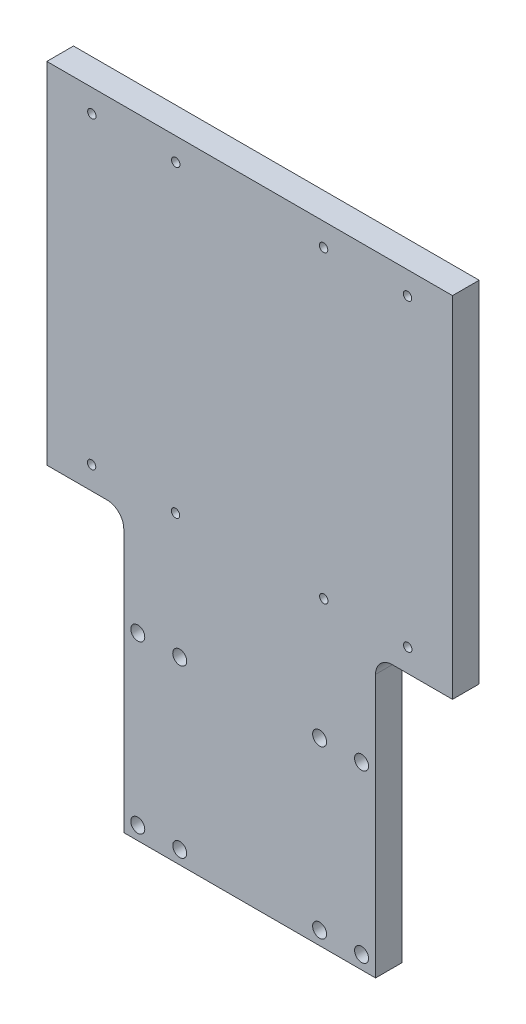
ISO-10303-21;
HEADER;
FILE_DESCRIPTION(('STEP AP214'),'2;1');
FILE_NAME('part.step','',(''),(''),'','','');
FILE_SCHEMA(('AUTOMOTIVE_DESIGN { 1 0 10303 214 1 1 1 1 }'));
ENDSEC;
DATA;
#1=APPLICATION_CONTEXT('core data for automotive mechanical design processes');
#2=APPLICATION_PROTOCOL_DEFINITION('international standard','automotive_design',2000,#1);
#3=PRODUCT_CONTEXT('',#1,'mechanical');
#4=PRODUCT('Part','Part','',(#3));
#5=PRODUCT_RELATED_PRODUCT_CATEGORY('part','',(#4));
#6=PRODUCT_DEFINITION_FORMATION('','',#4);
#7=PRODUCT_DEFINITION_CONTEXT('part definition',#1,'design');
#8=PRODUCT_DEFINITION('design','',#6,#7);
#9=PRODUCT_DEFINITION_SHAPE('','',#8);
#10=(LENGTH_UNIT() NAMED_UNIT(*) SI_UNIT(.MILLI.,.METRE.));
#11=(NAMED_UNIT(*) PLANE_ANGLE_UNIT() SI_UNIT($,.RADIAN.));
#12=(NAMED_UNIT(*) SI_UNIT($,.STERADIAN.) SOLID_ANGLE_UNIT());
#13=UNCERTAINTY_MEASURE_WITH_UNIT(LENGTH_MEASURE(1.E-05),#10,'distance_accuracy_value','');
#14=(GEOMETRIC_REPRESENTATION_CONTEXT(3) GLOBAL_UNCERTAINTY_ASSIGNED_CONTEXT((#13)) GLOBAL_UNIT_ASSIGNED_CONTEXT((#10,
#11,#12)) REPRESENTATION_CONTEXT('',''));
#15=CARTESIAN_POINT('',(0.,0.,0.));
#16=DIRECTION('',(0.,0.,1.));
#17=DIRECTION('',(1.,0.,0.));
#18=AXIS2_PLACEMENT_3D('',#15,#16,#17);
#19=CARTESIAN_POINT('',(-71.505,-62.5,9.53));
#20=DIRECTION('',(0.,1.,0.));
#21=DIRECTION('',(0.,0.,1.));
#22=AXIS2_PLACEMENT_3D('',#19,#20,#21);
#23=PLANE('',#22);
#24=DIRECTION('',(1.,0.,0.));
#25=VECTOR('',#24,1.);
#26=CARTESIAN_POINT('',(-71.505,-62.5,0.));
#27=LINE('',#26,#25);
#28=CARTESIAN_POINT('',(-72.505,-62.5,0.));
#29=VERTEX_POINT('',#28);
#30=CARTESIAN_POINT('',(-51.,-62.5,0.));
#31=VERTEX_POINT('',#30);
#32=EDGE_CURVE('E257',#29,#31,#27,.T.);
#33=ORIENTED_EDGE('',*,*,#32,.T.);
#34=DIRECTION('',(0.,0.,-1.));
#35=VECTOR('',#34,1.);
#36=CARTESIAN_POINT('',(-51.,-62.5,9.53));
#37=LINE('',#36,#35);
#38=CARTESIAN_POINT('',(-51.,-62.5,9.53));
#39=VERTEX_POINT('',#38);
#40=EDGE_CURVE('E57',#31,#39,#37,.F.);
#41=ORIENTED_EDGE('',*,*,#40,.T.);
#42=DIRECTION('',(1.,0.,0.));
#43=VECTOR('',#42,1.);
#44=CARTESIAN_POINT('',(-71.505,-62.5,9.53));
#45=LINE('',#44,#43);
#46=CARTESIAN_POINT('',(-72.505,-62.5,9.53));
#47=VERTEX_POINT('',#46);
#48=EDGE_CURVE('E258',#47,#39,#45,.T.);
#49=ORIENTED_EDGE('',*,*,#48,.F.);
#50=DIRECTION('',(0.,0.,1.));
#51=VECTOR('',#50,1.);
#52=CARTESIAN_POINT('',(-72.505,-62.5,-125.003999936002));
#53=LINE('',#52,#51);
#54=EDGE_CURVE('E153',#29,#47,#53,.T.);
#55=ORIENTED_EDGE('',*,*,#54,.F.);
#56=EDGE_LOOP('',(#33,#41,#49,#55));
#57=FACE_BOUND('',#56,.T.);
#58=ADVANCED_FACE('F42',(#57),#23,.F.);
#59=CARTESIAN_POINT('',(-45.,-62.5,9.53));
#60=DIRECTION('',(1.,0.,0.));
#61=DIRECTION('',(0.,1.,0.));
#62=AXIS2_PLACEMENT_3D('',#59,#60,#61);
#63=PLANE('',#62);
#64=DIRECTION('',(0.,-1.,0.));
#65=VECTOR('',#64,1.);
#66=CARTESIAN_POINT('',(-45.,-62.5,9.53));
#67=LINE('',#66,#65);
#68=CARTESIAN_POINT('',(-45.,-68.5,9.53));
#69=VERTEX_POINT('',#68);
#70=CARTESIAN_POINT('',(-45.,-162.5,9.53));
#71=VERTEX_POINT('',#70);
#72=EDGE_CURVE('E260',#69,#71,#67,.T.);
#73=ORIENTED_EDGE('',*,*,#72,.F.);
#74=DIRECTION('',(0.,0.,-1.));
#75=VECTOR('',#74,1.);
#76=CARTESIAN_POINT('',(-45.,-68.5,0.));
#77=LINE('',#76,#75);
#78=CARTESIAN_POINT('',(-45.,-68.5,0.));
#79=VERTEX_POINT('',#78);
#80=EDGE_CURVE('E287',#69,#79,#77,.T.);
#81=ORIENTED_EDGE('',*,*,#80,.T.);
#82=DIRECTION('',(0.,-1.,0.));
#83=VECTOR('',#82,1.);
#84=CARTESIAN_POINT('',(-45.,-62.5,0.));
#85=LINE('',#84,#83);
#86=CARTESIAN_POINT('',(-45.,-162.5,0.));
#87=VERTEX_POINT('',#86);
#88=EDGE_CURVE('E269',#79,#87,#85,.T.);
#89=ORIENTED_EDGE('',*,*,#88,.T.);
#90=DIRECTION('',(0.,0.,-1.));
#91=VECTOR('',#90,1.);
#92=CARTESIAN_POINT('',(-45.,-162.5,9.53));
#93=LINE('',#92,#91);
#94=EDGE_CURVE('E280',#71,#87,#93,.T.);
#95=ORIENTED_EDGE('',*,*,#94,.F.);
#96=EDGE_LOOP('',(#73,#81,#89,#95));
#97=FACE_BOUND('',#96,.T.);
#98=ADVANCED_FACE('F313',(#97),#63,.F.);
#99=CARTESIAN_POINT('',(-45.,-162.5,9.53));
#100=DIRECTION('',(0.,1.,0.));
#101=DIRECTION('',(0.,0.,1.));
#102=AXIS2_PLACEMENT_3D('',#99,#100,#101);
#103=PLANE('',#102);
#104=DIRECTION('',(1.,0.,0.));
#105=VECTOR('',#104,1.);
#106=CARTESIAN_POINT('',(-45.,-162.5,0.));
#107=LINE('',#106,#105);
#108=CARTESIAN_POINT('',(45.,-162.5,0.));
#109=VERTEX_POINT('',#108);
#110=EDGE_CURVE('E271',#87,#109,#107,.T.);
#111=ORIENTED_EDGE('',*,*,#110,.T.);
#112=DIRECTION('',(0.,0.,-1.));
#113=VECTOR('',#112,1.);
#114=CARTESIAN_POINT('',(45.,-162.5,9.53));
#115=LINE('',#114,#113);
#116=CARTESIAN_POINT('',(45.,-162.5,9.53));
#117=VERTEX_POINT('',#116);
#118=EDGE_CURVE('E267',#117,#109,#115,.T.);
#119=ORIENTED_EDGE('',*,*,#118,.F.);
#120=DIRECTION('',(1.,0.,0.));
#121=VECTOR('',#120,1.);
#122=CARTESIAN_POINT('',(-45.,-162.5,9.53));
#123=LINE('',#122,#121);
#124=EDGE_CURVE('E263',#71,#117,#123,.T.);
#125=ORIENTED_EDGE('',*,*,#124,.F.);
#126=ORIENTED_EDGE('',*,*,#94,.T.);
#127=EDGE_LOOP('',(#111,#119,#125,#126));
#128=FACE_BOUND('',#127,.T.);
#129=ADVANCED_FACE('F318',(#128),#103,.F.);
#130=CARTESIAN_POINT('',(45.,-62.5,9.53));
#131=DIRECTION('',(-1.,0.,0.));
#132=DIRECTION('',(0.,-1.,0.));
#133=AXIS2_PLACEMENT_3D('',#130,#131,#132);
#134=PLANE('',#133);
#135=DIRECTION('',(0.,1.,0.));
#136=VECTOR('',#135,1.);
#137=CARTESIAN_POINT('',(45.,-62.5,0.));
#138=LINE('',#137,#136);
#139=CARTESIAN_POINT('',(45.,-68.5,0.));
#140=VERTEX_POINT('',#139);
#141=EDGE_CURVE('E273',#109,#140,#138,.T.);
#142=ORIENTED_EDGE('',*,*,#141,.T.);
#143=DIRECTION('',(0.,0.,-1.));
#144=VECTOR('',#143,1.);
#145=CARTESIAN_POINT('',(45.,-68.5,9.53));
#146=LINE('',#145,#144);
#147=CARTESIAN_POINT('',(45.,-68.5,9.53));
#148=VERTEX_POINT('',#147);
#149=EDGE_CURVE('E285',#140,#148,#146,.F.);
#150=ORIENTED_EDGE('',*,*,#149,.T.);
#151=DIRECTION('',(0.,1.,0.));
#152=VECTOR('',#151,1.);
#153=CARTESIAN_POINT('',(45.,-62.5,9.53));
#154=LINE('',#153,#152);
#155=EDGE_CURVE('E129',#117,#148,#154,.T.);
#156=ORIENTED_EDGE('',*,*,#155,.F.);
#157=ORIENTED_EDGE('',*,*,#118,.T.);
#158=EDGE_LOOP('',(#142,#150,#156,#157));
#159=FACE_BOUND('',#158,.T.);
#160=ADVANCED_FACE('F299',(#159),#134,.F.);
#161=CARTESIAN_POINT('',(45.,-62.5,9.53));
#162=DIRECTION('',(0.,1.,0.));
#163=DIRECTION('',(0.,0.,1.));
#164=AXIS2_PLACEMENT_3D('',#161,#162,#163);
#165=PLANE('',#164);
#166=DIRECTION('',(1.,0.,0.));
#167=VECTOR('',#166,1.);
#168=CARTESIAN_POINT('',(45.,-62.5,9.53));
#169=LINE('',#168,#167);
#170=CARTESIAN_POINT('',(51.,-62.5,9.53));
#171=VERTEX_POINT('',#170);
#172=CARTESIAN_POINT('',(72.505,-62.5,9.53));
#173=VERTEX_POINT('',#172);
#174=EDGE_CURVE('E117',#171,#173,#169,.T.);
#175=ORIENTED_EDGE('',*,*,#174,.F.);
#176=DIRECTION('',(0.,0.,-1.));
#177=VECTOR('',#176,1.);
#178=CARTESIAN_POINT('',(51.,-62.5,0.));
#179=LINE('',#178,#177);
#180=CARTESIAN_POINT('',(51.,-62.5,0.));
#181=VERTEX_POINT('',#180);
#182=EDGE_CURVE('E283',#171,#181,#179,.T.);
#183=ORIENTED_EDGE('',*,*,#182,.T.);
#184=DIRECTION('',(1.,0.,0.));
#185=VECTOR('',#184,1.);
#186=CARTESIAN_POINT('',(45.,-62.5,0.));
#187=LINE('',#186,#185);
#188=CARTESIAN_POINT('',(72.505,-62.5,0.));
#189=VERTEX_POINT('',#188);
#190=EDGE_CURVE('E135',#181,#189,#187,.T.);
#191=ORIENTED_EDGE('',*,*,#190,.T.);
#192=DIRECTION('',(0.,0.,1.));
#193=VECTOR('',#192,1.);
#194=CARTESIAN_POINT('',(72.505,-62.5,-125.003999936002));
#195=LINE('',#194,#193);
#196=EDGE_CURVE('E132',#189,#173,#195,.T.);
#197=ORIENTED_EDGE('',*,*,#196,.T.);
#198=EDGE_LOOP('',(#175,#183,#191,#197));
#199=FACE_BOUND('',#198,.T.);
#200=ADVANCED_FACE('F133',(#199),#165,.F.);
#201=CARTESIAN_POINT('',(-71.505,62.5,9.53));
#202=DIRECTION('',(0.,-1.,0.));
#203=DIRECTION('',(0.,0.,-1.));
#204=AXIS2_PLACEMENT_3D('',#201,#202,#203);
#205=PLANE('',#204);
#206=DIRECTION('',(-1.,0.,0.));
#207=VECTOR('',#206,1.);
#208=CARTESIAN_POINT('',(-71.505,62.5,0.));
#209=LINE('',#208,#207);
#210=CARTESIAN_POINT('',(72.505,62.5,0.));
#211=VERTEX_POINT('',#210);
#212=CARTESIAN_POINT('',(-72.505,62.5,0.));
#213=VERTEX_POINT('',#212);
#214=EDGE_CURVE('E261',#211,#213,#209,.T.);
#215=ORIENTED_EDGE('',*,*,#214,.T.);
#216=DIRECTION('',(0.,0.,1.));
#217=VECTOR('',#216,1.);
#218=CARTESIAN_POINT('',(-72.505,62.5,-125.003999936002));
#219=LINE('',#218,#217);
#220=CARTESIAN_POINT('',(-72.505,62.5,9.53));
#221=VERTEX_POINT('',#220);
#222=EDGE_CURVE('E157',#213,#221,#219,.T.);
#223=ORIENTED_EDGE('',*,*,#222,.T.);
#224=DIRECTION('',(-1.,0.,0.));
#225=VECTOR('',#224,1.);
#226=CARTESIAN_POINT('',(-71.505,62.5,9.53));
#227=LINE('',#226,#225);
#228=CARTESIAN_POINT('',(72.505,62.5,9.53));
#229=VERTEX_POINT('',#228);
#230=EDGE_CURVE('E128',#229,#221,#227,.T.);
#231=ORIENTED_EDGE('',*,*,#230,.F.);
#232=DIRECTION('',(0.,0.,1.));
#233=VECTOR('',#232,1.);
#234=CARTESIAN_POINT('',(72.505,62.5,-125.003999936002));
#235=LINE('',#234,#233);
#236=EDGE_CURVE('E139',#211,#229,#235,.T.);
#237=ORIENTED_EDGE('',*,*,#236,.F.);
#238=EDGE_LOOP('',(#215,#223,#231,#237));
#239=FACE_BOUND('',#238,.T.);
#240=ADVANCED_FACE('F329',(#239),#205,.F.);
#241=CARTESIAN_POINT('',(-71.505,-62.5,9.53));
#242=DIRECTION('',(0.,0.,1.));
#243=DIRECTION('',(1.,0.,0.));
#244=AXIS2_PLACEMENT_3D('',#241,#242,#243);
#245=PLANE('',#244);
#246=CARTESIAN_POINT('',(-26.423186497269,54.3250000000001,9.53));
#247=DIRECTION('',(0.,0.,1.));
#248=DIRECTION('',(1.,0.,0.));
#249=AXIS2_PLACEMENT_3D('',#246,#247,#248);
#250=CIRCLE('',#249,1.5);
#251=CARTESIAN_POINT('',(-24.923186497269,54.3250000000001,9.53));
#252=VERTEX_POINT('',#251);
#253=EDGE_CURVE('E152',#252,#252,#250,.F.);
#254=ORIENTED_EDGE('',*,*,#253,.T.);
#255=EDGE_LOOP('',(#254));
#256=FACE_BOUND('',#255,.T.);
#257=CARTESIAN_POINT('',(-56.423186497269,54.325,9.53));
#258=DIRECTION('',(0.,0.,1.));
#259=DIRECTION('',(1.,0.,0.));
#260=AXIS2_PLACEMENT_3D('',#257,#258,#259);
#261=CIRCLE('',#260,1.5);
#262=CARTESIAN_POINT('',(-54.923186497269,54.325,9.53));
#263=VERTEX_POINT('',#262);
#264=EDGE_CURVE('E165',#263,#263,#261,.F.);
#265=ORIENTED_EDGE('',*,*,#264,.T.);
#266=EDGE_LOOP('',(#265));
#267=FACE_BOUND('',#266,.T.);
#268=CARTESIAN_POINT('',(26.4231864972689,54.3250000000001,9.53));
#269=DIRECTION('',(0.,0.,1.));
#270=DIRECTION('',(1.,0.,0.));
#271=AXIS2_PLACEMENT_3D('',#268,#269,#270);
#272=CIRCLE('',#271,1.5);
#273=CARTESIAN_POINT('',(27.9231864972689,54.3250000000001,9.53));
#274=VERTEX_POINT('',#273);
#275=EDGE_CURVE('E171',#274,#274,#272,.F.);
#276=ORIENTED_EDGE('',*,*,#275,.T.);
#277=EDGE_LOOP('',(#276));
#278=FACE_BOUND('',#277,.T.);
#279=CARTESIAN_POINT('',(56.4231864972689,54.3250000000001,9.53));
#280=DIRECTION('',(0.,0.,1.));
#281=DIRECTION('',(1.,0.,0.));
#282=AXIS2_PLACEMENT_3D('',#279,#280,#281);
#283=CIRCLE('',#282,1.50000000000001);
#284=CARTESIAN_POINT('',(57.9231864972689,54.3250000000001,9.53));
#285=VERTEX_POINT('',#284);
#286=EDGE_CURVE('E177',#285,#285,#283,.F.);
#287=ORIENTED_EDGE('',*,*,#286,.T.);
#288=EDGE_LOOP('',(#287));
#289=FACE_BOUND('',#288,.T.);
#290=CARTESIAN_POINT('',(56.5049999999999,-54.3249999999999,9.53));
#291=DIRECTION('',(0.,0.,1.));
#292=DIRECTION('',(1.,0.,0.));
#293=AXIS2_PLACEMENT_3D('',#290,#291,#292);
#294=CIRCLE('',#293,1.50000000000001);
#295=CARTESIAN_POINT('',(58.005,-54.3249999999999,9.53));
#296=VERTEX_POINT('',#295);
#297=EDGE_CURVE('E183',#296,#296,#294,.F.);
#298=ORIENTED_EDGE('',*,*,#297,.T.);
#299=EDGE_LOOP('',(#298));
#300=FACE_BOUND('',#299,.T.);
#301=CARTESIAN_POINT('',(26.5049999999999,-54.3249999999999,9.53));
#302=DIRECTION('',(0.,0.,1.));
#303=DIRECTION('',(1.,0.,0.));
#304=AXIS2_PLACEMENT_3D('',#301,#302,#303);
#305=CIRCLE('',#304,1.5);
#306=CARTESIAN_POINT('',(28.0049999999999,-54.3249999999999,9.53));
#307=VERTEX_POINT('',#306);
#308=EDGE_CURVE('E189',#307,#307,#305,.F.);
#309=ORIENTED_EDGE('',*,*,#308,.T.);
#310=EDGE_LOOP('',(#309));
#311=FACE_BOUND('',#310,.T.);
#312=CARTESIAN_POINT('',(-26.5050000000001,-54.3249999999999,9.53));
#313=DIRECTION('',(0.,0.,1.));
#314=DIRECTION('',(1.,0.,0.));
#315=AXIS2_PLACEMENT_3D('',#312,#313,#314);
#316=CIRCLE('',#315,1.5);
#317=CARTESIAN_POINT('',(-25.0050000000001,-54.3249999999999,9.53));
#318=VERTEX_POINT('',#317);
#319=EDGE_CURVE('E195',#318,#318,#316,.F.);
#320=ORIENTED_EDGE('',*,*,#319,.T.);
#321=EDGE_LOOP('',(#320));
#322=FACE_BOUND('',#321,.T.);
#323=CARTESIAN_POINT('',(-56.5050000000001,-54.325,9.53));
#324=DIRECTION('',(0.,0.,1.));
#325=DIRECTION('',(1.,0.,0.));
#326=AXIS2_PLACEMENT_3D('',#323,#324,#325);
#327=CIRCLE('',#326,1.5);
#328=CARTESIAN_POINT('',(-55.0050000000001,-54.325,9.53));
#329=VERTEX_POINT('',#328);
#330=EDGE_CURVE('E201',#329,#329,#327,.F.);
#331=ORIENTED_EDGE('',*,*,#330,.T.);
#332=EDGE_LOOP('',(#331));
#333=FACE_BOUND('',#332,.T.);
#334=CARTESIAN_POINT('',(-40.,-98.2,9.53));
#335=DIRECTION('',(0.,0.,1.));
#336=DIRECTION('',(-1.,0.,0.));
#337=AXIS2_PLACEMENT_3D('',#334,#335,#336);
#338=CIRCLE('',#337,2.5);
#339=CARTESIAN_POINT('',(-42.5,-98.2,9.53));
#340=VERTEX_POINT('',#339);
#341=EDGE_CURVE('E207',#340,#340,#338,.T.);
#342=ORIENTED_EDGE('',*,*,#341,.F.);
#343=EDGE_LOOP('',(#342));
#344=FACE_BOUND('',#343,.T.);
#345=CARTESIAN_POINT('',(-25.,-98.2,9.53));
#346=DIRECTION('',(0.,0.,1.));
#347=DIRECTION('',(-1.,0.,0.));
#348=AXIS2_PLACEMENT_3D('',#345,#346,#347);
#349=CIRCLE('',#348,2.5);
#350=CARTESIAN_POINT('',(-27.5,-98.2,9.53));
#351=VERTEX_POINT('',#350);
#352=EDGE_CURVE('E215',#351,#351,#349,.T.);
#353=ORIENTED_EDGE('',*,*,#352,.F.);
#354=EDGE_LOOP('',(#353));
#355=FACE_BOUND('',#354,.T.);
#356=CARTESIAN_POINT('',(25.,-98.2,9.53));
#357=DIRECTION('',(0.,0.,1.));
#358=DIRECTION('',(1.,0.,0.));
#359=AXIS2_PLACEMENT_3D('',#356,#357,#358);
#360=CIRCLE('',#359,2.5);
#361=CARTESIAN_POINT('',(27.5,-98.2,9.53));
#362=VERTEX_POINT('',#361);
#363=EDGE_CURVE('E221',#362,#362,#360,.T.);
#364=ORIENTED_EDGE('',*,*,#363,.F.);
#365=EDGE_LOOP('',(#364));
#366=FACE_BOUND('',#365,.T.);
#367=CARTESIAN_POINT('',(40.,-157.7,9.53));
#368=DIRECTION('',(0.,0.,1.));
#369=DIRECTION('',(-1.,0.,0.));
#370=AXIS2_PLACEMENT_3D('',#367,#368,#369);
#371=CIRCLE('',#370,2.5);
#372=CARTESIAN_POINT('',(37.5,-157.7,9.53));
#373=VERTEX_POINT('',#372);
#374=EDGE_CURVE('E227',#373,#373,#371,.T.);
#375=ORIENTED_EDGE('',*,*,#374,.F.);
#376=EDGE_LOOP('',(#375));
#377=FACE_BOUND('',#376,.T.);
#378=CARTESIAN_POINT('',(25.,-157.7,9.53));
#379=DIRECTION('',(0.,0.,1.));
#380=DIRECTION('',(-1.,0.,0.));
#381=AXIS2_PLACEMENT_3D('',#378,#379,#380);
#382=CIRCLE('',#381,2.5);
#383=CARTESIAN_POINT('',(22.5,-157.7,9.53));
#384=VERTEX_POINT('',#383);
#385=EDGE_CURVE('E233',#384,#384,#382,.T.);
#386=ORIENTED_EDGE('',*,*,#385,.F.);
#387=EDGE_LOOP('',(#386));
#388=FACE_BOUND('',#387,.T.);
#389=CARTESIAN_POINT('',(40.,-98.2,9.53));
#390=DIRECTION('',(0.,0.,1.));
#391=DIRECTION('',(1.,0.,0.));
#392=AXIS2_PLACEMENT_3D('',#389,#390,#391);
#393=CIRCLE('',#392,2.5);
#394=CARTESIAN_POINT('',(42.5,-98.2,9.53));
#395=VERTEX_POINT('',#394);
#396=EDGE_CURVE('E239',#395,#395,#393,.T.);
#397=ORIENTED_EDGE('',*,*,#396,.F.);
#398=EDGE_LOOP('',(#397));
#399=FACE_BOUND('',#398,.T.);
#400=CARTESIAN_POINT('',(-25.,-157.7,9.53));
#401=DIRECTION('',(0.,0.,1.));
#402=DIRECTION('',(1.,0.,0.));
#403=AXIS2_PLACEMENT_3D('',#400,#401,#402);
#404=CIRCLE('',#403,2.5);
#405=CARTESIAN_POINT('',(-22.5,-157.7,9.53));
#406=VERTEX_POINT('',#405);
#407=EDGE_CURVE('E245',#406,#406,#404,.T.);
#408=ORIENTED_EDGE('',*,*,#407,.F.);
#409=EDGE_LOOP('',(#408));
#410=FACE_BOUND('',#409,.T.);
#411=CARTESIAN_POINT('',(-40.,-157.7,9.53));
#412=DIRECTION('',(0.,0.,1.));
#413=DIRECTION('',(1.,0.,0.));
#414=AXIS2_PLACEMENT_3D('',#411,#412,#413);
#415=CIRCLE('',#414,2.5);
#416=CARTESIAN_POINT('',(-37.5,-157.7,9.53));
#417=VERTEX_POINT('',#416);
#418=EDGE_CURVE('E251',#417,#417,#415,.T.);
#419=ORIENTED_EDGE('',*,*,#418,.F.);
#420=EDGE_LOOP('',(#419));
#421=FACE_BOUND('',#420,.T.);
#422=ORIENTED_EDGE('',*,*,#230,.T.);
#423=DIRECTION('',(0.,-1.,0.));
#424=VECTOR('',#423,1.);
#425=CARTESIAN_POINT('',(-72.505,62.5,9.53));
#426=LINE('',#425,#424);
#427=EDGE_CURVE('E154',#221,#47,#426,.T.);
#428=ORIENTED_EDGE('',*,*,#427,.T.);
#429=ORIENTED_EDGE('',*,*,#48,.T.);
#430=CARTESIAN_POINT('',(-51.,-68.5,9.53));
#431=DIRECTION('',(0.,0.,1.));
#432=DIRECTION('',(1.,0.,0.));
#433=AXIS2_PLACEMENT_3D('',#430,#431,#432);
#434=CIRCLE('',#433,6.);
#435=EDGE_CURVE('E13',#39,#69,#434,.F.);
#436=ORIENTED_EDGE('',*,*,#435,.T.);
#437=ORIENTED_EDGE('',*,*,#72,.T.);
#438=ORIENTED_EDGE('',*,*,#124,.T.);
#439=ORIENTED_EDGE('',*,*,#155,.T.);
#440=CARTESIAN_POINT('',(51.,-68.5,9.53));
#441=DIRECTION('',(0.,0.,1.));
#442=DIRECTION('',(1.,0.,0.));
#443=AXIS2_PLACEMENT_3D('',#440,#441,#442);
#444=CIRCLE('',#443,6.);
#445=EDGE_CURVE('E124',#148,#171,#444,.F.);
#446=ORIENTED_EDGE('',*,*,#445,.T.);
#447=ORIENTED_EDGE('',*,*,#174,.T.);
#448=DIRECTION('',(0.,1.,0.));
#449=VECTOR('',#448,1.);
#450=CARTESIAN_POINT('',(72.505,-62.5,9.53));
#451=LINE('',#450,#449);
#452=EDGE_CURVE('E121',#173,#229,#451,.T.);
#453=ORIENTED_EDGE('',*,*,#452,.T.);
#454=EDGE_LOOP('',(#422,#428,#429,#436,#437,#438,#439,#446,#447,#453));
#455=FACE_BOUND('',#454,.T.);
#456=ADVANCED_FACE('F119',(#256,#267,#278,#289,#300,#311,#322,#333,#344,#355,#366,#377,#388,
#399,#410,#421,#455),#245,.T.);
#457=CARTESIAN_POINT('',(-71.505,-62.5,0.));
#458=DIRECTION('',(0.,0.,1.));
#459=DIRECTION('',(1.,0.,0.));
#460=AXIS2_PLACEMENT_3D('',#457,#458,#459);
#461=PLANE('',#460);
#462=CARTESIAN_POINT('',(-26.423186497269,54.3250000000001,0.));
#463=DIRECTION('',(0.,0.,-1.));
#464=DIRECTION('',(-1.,0.,0.));
#465=AXIS2_PLACEMENT_3D('',#462,#463,#464);
#466=CIRCLE('',#465,1.5);
#467=CARTESIAN_POINT('',(-27.923186497269,54.3250000000001,0.));
#468=VERTEX_POINT('',#467);
#469=EDGE_CURVE('E162',#468,#468,#466,.T.);
#470=ORIENTED_EDGE('',*,*,#469,.F.);
#471=EDGE_LOOP('',(#470));
#472=FACE_BOUND('',#471,.T.);
#473=CARTESIAN_POINT('',(-56.423186497269,54.325,0.));
#474=DIRECTION('',(0.,0.,-1.));
#475=DIRECTION('',(-1.,0.,0.));
#476=AXIS2_PLACEMENT_3D('',#473,#474,#475);
#477=CIRCLE('',#476,1.5);
#478=CARTESIAN_POINT('',(-57.923186497269,54.325,0.));
#479=VERTEX_POINT('',#478);
#480=EDGE_CURVE('E168',#479,#479,#477,.T.);
#481=ORIENTED_EDGE('',*,*,#480,.F.);
#482=EDGE_LOOP('',(#481));
#483=FACE_BOUND('',#482,.T.);
#484=CARTESIAN_POINT('',(26.4231864972689,54.3250000000001,0.));
#485=DIRECTION('',(0.,0.,-1.));
#486=DIRECTION('',(-1.,0.,0.));
#487=AXIS2_PLACEMENT_3D('',#484,#485,#486);
#488=CIRCLE('',#487,1.5);
#489=CARTESIAN_POINT('',(24.9231864972689,54.3250000000001,0.));
#490=VERTEX_POINT('',#489);
#491=EDGE_CURVE('E174',#490,#490,#488,.T.);
#492=ORIENTED_EDGE('',*,*,#491,.F.);
#493=EDGE_LOOP('',(#492));
#494=FACE_BOUND('',#493,.T.);
#495=CARTESIAN_POINT('',(56.4231864972689,54.3250000000001,0.));
#496=DIRECTION('',(0.,0.,-1.));
#497=DIRECTION('',(-1.,0.,0.));
#498=AXIS2_PLACEMENT_3D('',#495,#496,#497);
#499=CIRCLE('',#498,1.50000000000001);
#500=CARTESIAN_POINT('',(54.9231864972689,54.3250000000001,0.));
#501=VERTEX_POINT('',#500);
#502=EDGE_CURVE('E180',#501,#501,#499,.T.);
#503=ORIENTED_EDGE('',*,*,#502,.F.);
#504=EDGE_LOOP('',(#503));
#505=FACE_BOUND('',#504,.T.);
#506=CARTESIAN_POINT('',(56.5049999999999,-54.3249999999999,0.));
#507=DIRECTION('',(0.,0.,-1.));
#508=DIRECTION('',(-1.,0.,0.));
#509=AXIS2_PLACEMENT_3D('',#506,#507,#508);
#510=CIRCLE('',#509,1.50000000000001);
#511=CARTESIAN_POINT('',(55.0049999999999,-54.3249999999999,0.));
#512=VERTEX_POINT('',#511);
#513=EDGE_CURVE('E186',#512,#512,#510,.T.);
#514=ORIENTED_EDGE('',*,*,#513,.F.);
#515=EDGE_LOOP('',(#514));
#516=FACE_BOUND('',#515,.T.);
#517=CARTESIAN_POINT('',(26.5049999999999,-54.3249999999999,0.));
#518=DIRECTION('',(0.,0.,-1.));
#519=DIRECTION('',(-1.,0.,0.));
#520=AXIS2_PLACEMENT_3D('',#517,#518,#519);
#521=CIRCLE('',#520,1.5);
#522=CARTESIAN_POINT('',(25.0049999999999,-54.3249999999999,0.));
#523=VERTEX_POINT('',#522);
#524=EDGE_CURVE('E192',#523,#523,#521,.T.);
#525=ORIENTED_EDGE('',*,*,#524,.F.);
#526=EDGE_LOOP('',(#525));
#527=FACE_BOUND('',#526,.T.);
#528=CARTESIAN_POINT('',(-26.5050000000001,-54.3249999999999,0.));
#529=DIRECTION('',(0.,0.,-1.));
#530=DIRECTION('',(-1.,0.,0.));
#531=AXIS2_PLACEMENT_3D('',#528,#529,#530);
#532=CIRCLE('',#531,1.5);
#533=CARTESIAN_POINT('',(-28.0050000000001,-54.3249999999999,0.));
#534=VERTEX_POINT('',#533);
#535=EDGE_CURVE('E198',#534,#534,#532,.T.);
#536=ORIENTED_EDGE('',*,*,#535,.F.);
#537=EDGE_LOOP('',(#536));
#538=FACE_BOUND('',#537,.T.);
#539=CARTESIAN_POINT('',(-56.5050000000001,-54.325,0.));
#540=DIRECTION('',(0.,0.,-1.));
#541=DIRECTION('',(-1.,0.,0.));
#542=AXIS2_PLACEMENT_3D('',#539,#540,#541);
#543=CIRCLE('',#542,1.5);
#544=CARTESIAN_POINT('',(-58.0050000000001,-54.325,0.));
#545=VERTEX_POINT('',#544);
#546=EDGE_CURVE('E204',#545,#545,#543,.T.);
#547=ORIENTED_EDGE('',*,*,#546,.F.);
#548=EDGE_LOOP('',(#547));
#549=FACE_BOUND('',#548,.T.);
#550=CARTESIAN_POINT('',(-40.,-98.2,0.));
#551=DIRECTION('',(0.,0.,1.));
#552=DIRECTION('',(1.,0.,0.));
#553=AXIS2_PLACEMENT_3D('',#550,#551,#552);
#554=CIRCLE('',#553,2.5);
#555=CARTESIAN_POINT('',(-37.5,-98.2,0.));
#556=VERTEX_POINT('',#555);
#557=EDGE_CURVE('E212',#556,#556,#554,.F.);
#558=ORIENTED_EDGE('',*,*,#557,.F.);
#559=EDGE_LOOP('',(#558));
#560=FACE_BOUND('',#559,.T.);
#561=CARTESIAN_POINT('',(-25.,-98.2,0.));
#562=DIRECTION('',(0.,0.,1.));
#563=DIRECTION('',(1.,0.,0.));
#564=AXIS2_PLACEMENT_3D('',#561,#562,#563);
#565=CIRCLE('',#564,2.5);
#566=CARTESIAN_POINT('',(-22.5,-98.2,0.));
#567=VERTEX_POINT('',#566);
#568=EDGE_CURVE('E218',#567,#567,#565,.F.);
#569=ORIENTED_EDGE('',*,*,#568,.F.);
#570=EDGE_LOOP('',(#569));
#571=FACE_BOUND('',#570,.T.);
#572=CARTESIAN_POINT('',(25.,-98.2,0.));
#573=DIRECTION('',(0.,0.,1.));
#574=DIRECTION('',(1.,0.,0.));
#575=AXIS2_PLACEMENT_3D('',#572,#573,#574);
#576=CIRCLE('',#575,2.5);
#577=CARTESIAN_POINT('',(27.5,-98.2,0.));
#578=VERTEX_POINT('',#577);
#579=EDGE_CURVE('E224',#578,#578,#576,.F.);
#580=ORIENTED_EDGE('',*,*,#579,.F.);
#581=EDGE_LOOP('',(#580));
#582=FACE_BOUND('',#581,.T.);
#583=CARTESIAN_POINT('',(40.,-157.7,0.));
#584=DIRECTION('',(0.,0.,1.));
#585=DIRECTION('',(1.,0.,0.));
#586=AXIS2_PLACEMENT_3D('',#583,#584,#585);
#587=CIRCLE('',#586,2.5);
#588=CARTESIAN_POINT('',(42.5,-157.7,0.));
#589=VERTEX_POINT('',#588);
#590=EDGE_CURVE('E230',#589,#589,#587,.F.);
#591=ORIENTED_EDGE('',*,*,#590,.F.);
#592=EDGE_LOOP('',(#591));
#593=FACE_BOUND('',#592,.T.);
#594=CARTESIAN_POINT('',(25.,-157.7,0.));
#595=DIRECTION('',(0.,0.,1.));
#596=DIRECTION('',(1.,0.,0.));
#597=AXIS2_PLACEMENT_3D('',#594,#595,#596);
#598=CIRCLE('',#597,2.5);
#599=CARTESIAN_POINT('',(27.5,-157.7,0.));
#600=VERTEX_POINT('',#599);
#601=EDGE_CURVE('E236',#600,#600,#598,.F.);
#602=ORIENTED_EDGE('',*,*,#601,.F.);
#603=EDGE_LOOP('',(#602));
#604=FACE_BOUND('',#603,.T.);
#605=CARTESIAN_POINT('',(40.,-98.2,0.));
#606=DIRECTION('',(0.,0.,1.));
#607=DIRECTION('',(1.,0.,0.));
#608=AXIS2_PLACEMENT_3D('',#605,#606,#607);
#609=CIRCLE('',#608,2.5);
#610=CARTESIAN_POINT('',(42.5,-98.2,0.));
#611=VERTEX_POINT('',#610);
#612=EDGE_CURVE('E242',#611,#611,#609,.F.);
#613=ORIENTED_EDGE('',*,*,#612,.F.);
#614=EDGE_LOOP('',(#613));
#615=FACE_BOUND('',#614,.T.);
#616=CARTESIAN_POINT('',(-25.,-157.7,0.));
#617=DIRECTION('',(0.,0.,1.));
#618=DIRECTION('',(1.,0.,0.));
#619=AXIS2_PLACEMENT_3D('',#616,#617,#618);
#620=CIRCLE('',#619,2.5);
#621=CARTESIAN_POINT('',(-22.5,-157.7,0.));
#622=VERTEX_POINT('',#621);
#623=EDGE_CURVE('E248',#622,#622,#620,.F.);
#624=ORIENTED_EDGE('',*,*,#623,.F.);
#625=EDGE_LOOP('',(#624));
#626=FACE_BOUND('',#625,.T.);
#627=CARTESIAN_POINT('',(-40.,-157.7,0.));
#628=DIRECTION('',(0.,0.,1.));
#629=DIRECTION('',(1.,0.,0.));
#630=AXIS2_PLACEMENT_3D('',#627,#628,#629);
#631=CIRCLE('',#630,2.5);
#632=CARTESIAN_POINT('',(-37.5,-157.7,0.));
#633=VERTEX_POINT('',#632);
#634=EDGE_CURVE('E254',#633,#633,#631,.F.);
#635=ORIENTED_EDGE('',*,*,#634,.F.);
#636=EDGE_LOOP('',(#635));
#637=FACE_BOUND('',#636,.T.);
#638=ORIENTED_EDGE('',*,*,#32,.F.);
#639=DIRECTION('',(0.,1.,0.));
#640=VECTOR('',#639,1.);
#641=CARTESIAN_POINT('',(-72.505,62.5,0.));
#642=LINE('',#641,#640);
#643=EDGE_CURVE('E149',#29,#213,#642,.T.);
#644=ORIENTED_EDGE('',*,*,#643,.T.);
#645=ORIENTED_EDGE('',*,*,#214,.F.);
#646=DIRECTION('',(0.,-1.,0.));
#647=VECTOR('',#646,1.);
#648=CARTESIAN_POINT('',(72.505,-62.5,0.));
#649=LINE('',#648,#647);
#650=EDGE_CURVE('E147',#211,#189,#649,.T.);
#651=ORIENTED_EDGE('',*,*,#650,.T.);
#652=ORIENTED_EDGE('',*,*,#190,.F.);
#653=CARTESIAN_POINT('',(51.,-68.5,0.));
#654=DIRECTION('',(0.,0.,1.));
#655=DIRECTION('',(1.,0.,0.));
#656=AXIS2_PLACEMENT_3D('',#653,#654,#655);
#657=CIRCLE('',#656,6.);
#658=EDGE_CURVE('E291',#181,#140,#657,.T.);
#659=ORIENTED_EDGE('',*,*,#658,.T.);
#660=ORIENTED_EDGE('',*,*,#141,.F.);
#661=ORIENTED_EDGE('',*,*,#110,.F.);
#662=ORIENTED_EDGE('',*,*,#88,.F.);
#663=CARTESIAN_POINT('',(-51.,-68.5,0.));
#664=DIRECTION('',(0.,0.,1.));
#665=DIRECTION('',(1.,0.,0.));
#666=AXIS2_PLACEMENT_3D('',#663,#664,#665);
#667=CIRCLE('',#666,6.);
#668=EDGE_CURVE('E50',#79,#31,#667,.T.);
#669=ORIENTED_EDGE('',*,*,#668,.T.);
#670=EDGE_LOOP('',(#638,#644,#645,#651,#652,#659,#660,#661,#662,#669));
#671=FACE_BOUND('',#670,.T.);
#672=ADVANCED_FACE('F294',(#472,#483,#494,#505,#516,#527,#538,#549,#560,#571,#582,#593,#604,
#615,#626,#637,#671),#461,.F.);
#673=CARTESIAN_POINT('',(-40.,-157.7,-0.000999999999999265));
#674=DIRECTION('',(0.,0.,1.));
#675=DIRECTION('',(1.,0.,0.));
#676=AXIS2_PLACEMENT_3D('',#673,#674,#675);
#677=CYLINDRICAL_SURFACE('',#676,2.5);
#678=ORIENTED_EDGE('',*,*,#418,.T.);
#679=EDGE_LOOP('',(#678));
#680=FACE_BOUND('',#679,.T.);
#681=ORIENTED_EDGE('',*,*,#634,.T.);
#682=EDGE_LOOP('',(#681));
#683=FACE_BOUND('',#682,.T.);
#684=ADVANCED_FACE('F335',(#680,#683),#677,.F.);
#685=CARTESIAN_POINT('',(-25.,-157.7,-0.000999999999999265));
#686=DIRECTION('',(0.,0.,1.));
#687=DIRECTION('',(1.,0.,0.));
#688=AXIS2_PLACEMENT_3D('',#685,#686,#687);
#689=CYLINDRICAL_SURFACE('',#688,2.5);
#690=ORIENTED_EDGE('',*,*,#407,.T.);
#691=EDGE_LOOP('',(#690));
#692=FACE_BOUND('',#691,.T.);
#693=ORIENTED_EDGE('',*,*,#623,.T.);
#694=EDGE_LOOP('',(#693));
#695=FACE_BOUND('',#694,.T.);
#696=ADVANCED_FACE('F342',(#692,#695),#689,.F.);
#697=CARTESIAN_POINT('',(40.,-98.2,-0.000999999999999265));
#698=DIRECTION('',(0.,0.,1.));
#699=DIRECTION('',(1.,0.,0.));
#700=AXIS2_PLACEMENT_3D('',#697,#698,#699);
#701=CYLINDRICAL_SURFACE('',#700,2.5);
#702=ORIENTED_EDGE('',*,*,#396,.T.);
#703=EDGE_LOOP('',(#702));
#704=FACE_BOUND('',#703,.T.);
#705=ORIENTED_EDGE('',*,*,#612,.T.);
#706=EDGE_LOOP('',(#705));
#707=FACE_BOUND('',#706,.T.);
#708=ADVANCED_FACE('F346',(#704,#707),#701,.F.);
#709=CARTESIAN_POINT('',(25.,-157.7,-0.000999999999999265));
#710=DIRECTION('',(0.,0.,1.));
#711=DIRECTION('',(1.,0.,0.));
#712=AXIS2_PLACEMENT_3D('',#709,#710,#711);
#713=CYLINDRICAL_SURFACE('',#712,2.5);
#714=ORIENTED_EDGE('',*,*,#385,.T.);
#715=EDGE_LOOP('',(#714));
#716=FACE_BOUND('',#715,.T.);
#717=ORIENTED_EDGE('',*,*,#601,.T.);
#718=EDGE_LOOP('',(#717));
#719=FACE_BOUND('',#718,.T.);
#720=ADVANCED_FACE('F350',(#716,#719),#713,.F.);
#721=CARTESIAN_POINT('',(40.,-157.7,-0.000999999999999265));
#722=DIRECTION('',(0.,0.,1.));
#723=DIRECTION('',(1.,0.,0.));
#724=AXIS2_PLACEMENT_3D('',#721,#722,#723);
#725=CYLINDRICAL_SURFACE('',#724,2.5);
#726=ORIENTED_EDGE('',*,*,#374,.T.);
#727=EDGE_LOOP('',(#726));
#728=FACE_BOUND('',#727,.T.);
#729=ORIENTED_EDGE('',*,*,#590,.T.);
#730=EDGE_LOOP('',(#729));
#731=FACE_BOUND('',#730,.T.);
#732=ADVANCED_FACE('F354',(#728,#731),#725,.F.);
#733=CARTESIAN_POINT('',(25.,-98.2,-0.000999999999999265));
#734=DIRECTION('',(0.,0.,1.));
#735=DIRECTION('',(1.,0.,0.));
#736=AXIS2_PLACEMENT_3D('',#733,#734,#735);
#737=CYLINDRICAL_SURFACE('',#736,2.5);
#738=ORIENTED_EDGE('',*,*,#363,.T.);
#739=EDGE_LOOP('',(#738));
#740=FACE_BOUND('',#739,.T.);
#741=ORIENTED_EDGE('',*,*,#579,.T.);
#742=EDGE_LOOP('',(#741));
#743=FACE_BOUND('',#742,.T.);
#744=ADVANCED_FACE('F358',(#740,#743),#737,.F.);
#745=CARTESIAN_POINT('',(-25.,-98.2,-0.000999999999999265));
#746=DIRECTION('',(0.,0.,1.));
#747=DIRECTION('',(1.,0.,0.));
#748=AXIS2_PLACEMENT_3D('',#745,#746,#747);
#749=CYLINDRICAL_SURFACE('',#748,2.5);
#750=ORIENTED_EDGE('',*,*,#352,.T.);
#751=EDGE_LOOP('',(#750));
#752=FACE_BOUND('',#751,.T.);
#753=ORIENTED_EDGE('',*,*,#568,.T.);
#754=EDGE_LOOP('',(#753));
#755=FACE_BOUND('',#754,.T.);
#756=ADVANCED_FACE('F362',(#752,#755),#749,.F.);
#757=CARTESIAN_POINT('',(-40.,-98.2,-0.000999999999999265));
#758=DIRECTION('',(0.,0.,1.));
#759=DIRECTION('',(1.,0.,0.));
#760=AXIS2_PLACEMENT_3D('',#757,#758,#759);
#761=CYLINDRICAL_SURFACE('',#760,2.5);
#762=ORIENTED_EDGE('',*,*,#341,.T.);
#763=EDGE_LOOP('',(#762));
#764=FACE_BOUND('',#763,.T.);
#765=ORIENTED_EDGE('',*,*,#557,.T.);
#766=EDGE_LOOP('',(#765));
#767=FACE_BOUND('',#766,.T.);
#768=ADVANCED_FACE('F366',(#764,#767),#761,.F.);
#769=CARTESIAN_POINT('',(-56.5050000000001,-54.325,9.531));
#770=DIRECTION('',(0.,0.,-1.));
#771=DIRECTION('',(-1.,0.,0.));
#772=AXIS2_PLACEMENT_3D('',#769,#770,#771);
#773=CYLINDRICAL_SURFACE('',#772,1.5);
#774=ORIENTED_EDGE('',*,*,#330,.F.);
#775=EDGE_LOOP('',(#774));
#776=FACE_BOUND('',#775,.T.);
#777=ORIENTED_EDGE('',*,*,#546,.T.);
#778=EDGE_LOOP('',(#777));
#779=FACE_BOUND('',#778,.T.);
#780=ADVANCED_FACE('F370',(#776,#779),#773,.F.);
#781=CARTESIAN_POINT('',(-26.5050000000001,-54.3249999999999,9.531));
#782=DIRECTION('',(0.,0.,-1.));
#783=DIRECTION('',(-1.,0.,0.));
#784=AXIS2_PLACEMENT_3D('',#781,#782,#783);
#785=CYLINDRICAL_SURFACE('',#784,1.5);
#786=ORIENTED_EDGE('',*,*,#319,.F.);
#787=EDGE_LOOP('',(#786));
#788=FACE_BOUND('',#787,.T.);
#789=ORIENTED_EDGE('',*,*,#535,.T.);
#790=EDGE_LOOP('',(#789));
#791=FACE_BOUND('',#790,.T.);
#792=ADVANCED_FACE('F374',(#788,#791),#785,.F.);
#793=CARTESIAN_POINT('',(26.5049999999999,-54.3249999999999,9.531));
#794=DIRECTION('',(0.,0.,-1.));
#795=DIRECTION('',(-1.,0.,0.));
#796=AXIS2_PLACEMENT_3D('',#793,#794,#795);
#797=CYLINDRICAL_SURFACE('',#796,1.5);
#798=ORIENTED_EDGE('',*,*,#308,.F.);
#799=EDGE_LOOP('',(#798));
#800=FACE_BOUND('',#799,.T.);
#801=ORIENTED_EDGE('',*,*,#524,.T.);
#802=EDGE_LOOP('',(#801));
#803=FACE_BOUND('',#802,.T.);
#804=ADVANCED_FACE('F378',(#800,#803),#797,.F.);
#805=CARTESIAN_POINT('',(56.5049999999999,-54.3249999999999,9.531));
#806=DIRECTION('',(0.,0.,-1.));
#807=DIRECTION('',(-1.,0.,0.));
#808=AXIS2_PLACEMENT_3D('',#805,#806,#807);
#809=CYLINDRICAL_SURFACE('',#808,1.50000000000001);
#810=ORIENTED_EDGE('',*,*,#297,.F.);
#811=EDGE_LOOP('',(#810));
#812=FACE_BOUND('',#811,.T.);
#813=ORIENTED_EDGE('',*,*,#513,.T.);
#814=EDGE_LOOP('',(#813));
#815=FACE_BOUND('',#814,.T.);
#816=ADVANCED_FACE('F382',(#812,#815),#809,.F.);
#817=CARTESIAN_POINT('',(56.4231864972689,54.3250000000001,9.531));
#818=DIRECTION('',(0.,0.,-1.));
#819=DIRECTION('',(-1.,0.,0.));
#820=AXIS2_PLACEMENT_3D('',#817,#818,#819);
#821=CYLINDRICAL_SURFACE('',#820,1.50000000000001);
#822=ORIENTED_EDGE('',*,*,#286,.F.);
#823=EDGE_LOOP('',(#822));
#824=FACE_BOUND('',#823,.T.);
#825=ORIENTED_EDGE('',*,*,#502,.T.);
#826=EDGE_LOOP('',(#825));
#827=FACE_BOUND('',#826,.T.);
#828=ADVANCED_FACE('F386',(#824,#827),#821,.F.);
#829=CARTESIAN_POINT('',(26.4231864972689,54.3250000000001,9.531));
#830=DIRECTION('',(0.,0.,-1.));
#831=DIRECTION('',(-1.,0.,0.));
#832=AXIS2_PLACEMENT_3D('',#829,#830,#831);
#833=CYLINDRICAL_SURFACE('',#832,1.5);
#834=ORIENTED_EDGE('',*,*,#275,.F.);
#835=EDGE_LOOP('',(#834));
#836=FACE_BOUND('',#835,.T.);
#837=ORIENTED_EDGE('',*,*,#491,.T.);
#838=EDGE_LOOP('',(#837));
#839=FACE_BOUND('',#838,.T.);
#840=ADVANCED_FACE('F390',(#836,#839),#833,.F.);
#841=CARTESIAN_POINT('',(-56.423186497269,54.325,9.531));
#842=DIRECTION('',(0.,0.,-1.));
#843=DIRECTION('',(-1.,0.,0.));
#844=AXIS2_PLACEMENT_3D('',#841,#842,#843);
#845=CYLINDRICAL_SURFACE('',#844,1.5);
#846=ORIENTED_EDGE('',*,*,#264,.F.);
#847=EDGE_LOOP('',(#846));
#848=FACE_BOUND('',#847,.T.);
#849=ORIENTED_EDGE('',*,*,#480,.T.);
#850=EDGE_LOOP('',(#849));
#851=FACE_BOUND('',#850,.T.);
#852=ADVANCED_FACE('F394',(#848,#851),#845,.F.);
#853=CARTESIAN_POINT('',(-26.423186497269,54.3250000000001,9.531));
#854=DIRECTION('',(0.,0.,-1.));
#855=DIRECTION('',(-1.,0.,0.));
#856=AXIS2_PLACEMENT_3D('',#853,#854,#855);
#857=CYLINDRICAL_SURFACE('',#856,1.5);
#858=ORIENTED_EDGE('',*,*,#253,.F.);
#859=EDGE_LOOP('',(#858));
#860=FACE_BOUND('',#859,.T.);
#861=ORIENTED_EDGE('',*,*,#469,.T.);
#862=EDGE_LOOP('',(#861));
#863=FACE_BOUND('',#862,.T.);
#864=ADVANCED_FACE('F398',(#860,#863),#857,.F.);
#865=CARTESIAN_POINT('',(-72.505,62.5,-125.003999936002));
#866=DIRECTION('',(-1.,0.,0.));
#867=DIRECTION('',(0.,-1.,0.));
#868=AXIS2_PLACEMENT_3D('',#865,#866,#867);
#869=PLANE('',#868);
#870=ORIENTED_EDGE('',*,*,#643,.F.);
#871=ORIENTED_EDGE('',*,*,#54,.T.);
#872=ORIENTED_EDGE('',*,*,#427,.F.);
#873=ORIENTED_EDGE('',*,*,#222,.F.);
#874=EDGE_LOOP('',(#870,#871,#872,#873));
#875=FACE_BOUND('',#874,.T.);
#876=ADVANCED_FACE('F309',(#875),#869,.T.);
#877=CARTESIAN_POINT('',(72.505,-62.5,-125.003999936002));
#878=DIRECTION('',(1.,0.,0.));
#879=DIRECTION('',(0.,0.,-1.));
#880=AXIS2_PLACEMENT_3D('',#877,#878,#879);
#881=PLANE('',#880);
#882=ORIENTED_EDGE('',*,*,#650,.F.);
#883=ORIENTED_EDGE('',*,*,#236,.T.);
#884=ORIENTED_EDGE('',*,*,#452,.F.);
#885=ORIENTED_EDGE('',*,*,#196,.F.);
#886=EDGE_LOOP('',(#882,#883,#884,#885));
#887=FACE_BOUND('',#886,.T.);
#888=ADVANCED_FACE('F142',(#887),#881,.T.);
#889=CARTESIAN_POINT('',(51.,-68.5,9.53));
#890=DIRECTION('',(0.,0.,1.));
#891=DIRECTION('',(1.,0.,0.));
#892=AXIS2_PLACEMENT_3D('',#889,#890,#891);
#893=CYLINDRICAL_SURFACE('',#892,6.);
#894=ORIENTED_EDGE('',*,*,#445,.F.);
#895=ORIENTED_EDGE('',*,*,#149,.F.);
#896=ORIENTED_EDGE('',*,*,#658,.F.);
#897=ORIENTED_EDGE('',*,*,#182,.F.);
#898=EDGE_LOOP('',(#894,#895,#896,#897));
#899=FACE_BOUND('',#898,.T.);
#900=ADVANCED_FACE('F302',(#899),#893,.F.);
#901=CARTESIAN_POINT('',(-51.,-68.5,9.53));
#902=DIRECTION('',(0.,0.,1.));
#903=DIRECTION('',(1.,0.,0.));
#904=AXIS2_PLACEMENT_3D('',#901,#902,#903);
#905=CYLINDRICAL_SURFACE('',#904,6.);
#906=ORIENTED_EDGE('',*,*,#435,.F.);
#907=ORIENTED_EDGE('',*,*,#40,.F.);
#908=ORIENTED_EDGE('',*,*,#668,.F.);
#909=ORIENTED_EDGE('',*,*,#80,.F.);
#910=EDGE_LOOP('',(#906,#907,#908,#909));
#911=FACE_BOUND('',#910,.T.);
#912=ADVANCED_FACE('F44',(#911),#905,.F.);
#913=CLOSED_SHELL('',(#58,#98,#129,#160,#200,#240,#456,#672,#684,#696,#708,#720,#732,#744,#756,
#768,#780,#792,#804,#816,#828,#840,#852,#864,#876,#888,#900,#912));
#914=MANIFOLD_SOLID_BREP('B2',#913);
#915=ADVANCED_BREP_SHAPE_REPRESENTATION('',(#18,#914),#14);
#916=SHAPE_DEFINITION_REPRESENTATION(#9,#915);
ENDSEC;
END-ISO-10303-21;
